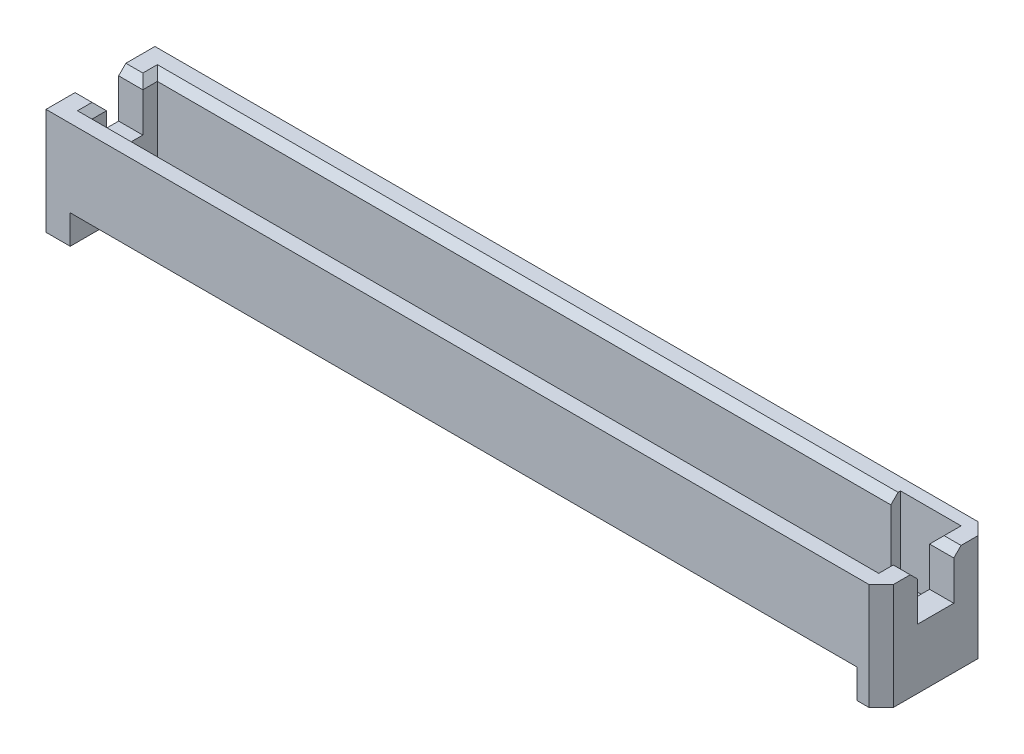
ISO-10303-21;
HEADER;
FILE_DESCRIPTION(('STEP AP214'),'2;1');
FILE_NAME('part.step','',(''),(''),'','','');
FILE_SCHEMA(('AUTOMOTIVE_DESIGN { 1 0 10303 214 1 1 1 1 }'));
ENDSEC;
DATA;
#1=APPLICATION_CONTEXT('core data for automotive mechanical design processes');
#2=APPLICATION_PROTOCOL_DEFINITION('international standard','automotive_design',2000,#1);
#3=PRODUCT_CONTEXT('',#1,'mechanical');
#4=PRODUCT('Part','Part','',(#3));
#5=PRODUCT_RELATED_PRODUCT_CATEGORY('part','',(#4));
#6=PRODUCT_DEFINITION_FORMATION('','',#4);
#7=PRODUCT_DEFINITION_CONTEXT('part definition',#1,'design');
#8=PRODUCT_DEFINITION('design','',#6,#7);
#9=PRODUCT_DEFINITION_SHAPE('','',#8);
#10=(LENGTH_UNIT() NAMED_UNIT(*) SI_UNIT(.MILLI.,.METRE.));
#11=(NAMED_UNIT(*) PLANE_ANGLE_UNIT() SI_UNIT($,.RADIAN.));
#12=(NAMED_UNIT(*) SI_UNIT($,.STERADIAN.) SOLID_ANGLE_UNIT());
#13=UNCERTAINTY_MEASURE_WITH_UNIT(LENGTH_MEASURE(1.E-05),#10,'distance_accuracy_value','');
#14=(GEOMETRIC_REPRESENTATION_CONTEXT(3) GLOBAL_UNCERTAINTY_ASSIGNED_CONTEXT((#13)) GLOBAL_UNIT_ASSIGNED_CONTEXT((#10,
#11,#12)) REPRESENTATION_CONTEXT('',''));
#15=CARTESIAN_POINT('',(0.,0.,0.));
#16=DIRECTION('',(0.,0.,1.));
#17=DIRECTION('',(1.,0.,0.));
#18=AXIS2_PLACEMENT_3D('',#15,#16,#17);
#19=CARTESIAN_POINT('',(21.2725,5.588,2.8575));
#20=DIRECTION('',(-0.707106781186547,0.,-0.707106781186548));
#21=DIRECTION('',(-0.707106781186548,0.,0.707106781186547));
#22=AXIS2_PLACEMENT_3D('',#19,#20,#21);
#23=PLANE('',#22);
#24=DIRECTION('',(0.707106781186548,0.,-0.707106781186547));
#25=VECTOR('',#24,1.);
#26=CARTESIAN_POINT('',(21.2725,0.,2.8575));
#27=LINE('',#26,#25);
#28=CARTESIAN_POINT('',(21.2725,0.,2.8575));
#29=VERTEX_POINT('',#28);
#30=CARTESIAN_POINT('',(21.9075,0.,2.2225));
#31=VERTEX_POINT('',#30);
#32=EDGE_CURVE('E10',#29,#31,#27,.T.);
#33=ORIENTED_EDGE('',*,*,#32,.T.);
#34=DIRECTION('',(0.,-1.,0.));
#35=VECTOR('',#34,1.);
#36=CARTESIAN_POINT('',(21.9075,5.588,2.2225));
#37=LINE('',#36,#35);
#38=CARTESIAN_POINT('',(21.9075,5.588,2.2225));
#39=VERTEX_POINT('',#38);
#40=EDGE_CURVE('E24',#39,#31,#37,.T.);
#41=ORIENTED_EDGE('',*,*,#40,.F.);
#42=DIRECTION('',(0.707106781186548,0.,-0.707106781186547));
#43=VECTOR('',#42,1.);
#44=CARTESIAN_POINT('',(21.2725,5.588,2.8575));
#45=LINE('',#44,#43);
#46=CARTESIAN_POINT('',(21.2725,5.588,2.8575));
#47=VERTEX_POINT('',#46);
#48=EDGE_CURVE('E752',#47,#39,#45,.T.);
#49=ORIENTED_EDGE('',*,*,#48,.F.);
#50=DIRECTION('',(0.,-1.,0.));
#51=VECTOR('',#50,1.);
#52=CARTESIAN_POINT('',(21.2725,5.588,2.8575));
#53=LINE('',#52,#51);
#54=EDGE_CURVE('E747',#47,#29,#53,.T.);
#55=ORIENTED_EDGE('',*,*,#54,.T.);
#56=EDGE_LOOP('',(#33,#41,#49,#55));
#57=FACE_BOUND('',#56,.T.);
#58=ADVANCED_FACE('F15',(#57),#23,.F.);
#59=CARTESIAN_POINT('',(-21.9075,5.588,2.8575));
#60=DIRECTION('',(0.,0.,-1.));
#61=DIRECTION('',(-1.,0.,0.));
#62=AXIS2_PLACEMENT_3D('',#59,#60,#61);
#63=PLANE('',#62);
#64=DIRECTION('',(-1.,0.,0.));
#65=VECTOR('',#64,1.);
#66=CARTESIAN_POINT('',(20.6375,1.524,2.8575));
#67=LINE('',#66,#65);
#68=CARTESIAN_POINT('',(20.6375,1.524,2.8575));
#69=VERTEX_POINT('',#68);
#70=CARTESIAN_POINT('',(-20.6375,1.524,2.8575));
#71=VERTEX_POINT('',#70);
#72=EDGE_CURVE('E741',#69,#71,#67,.T.);
#73=ORIENTED_EDGE('',*,*,#72,.F.);
#74=DIRECTION('',(0.,-1.,0.));
#75=VECTOR('',#74,1.);
#76=CARTESIAN_POINT('',(20.6375,1.524,2.8575));
#77=LINE('',#76,#75);
#78=CARTESIAN_POINT('',(20.6375,0.,2.8575));
#79=VERTEX_POINT('',#78);
#80=EDGE_CURVE('E736',#69,#79,#77,.T.);
#81=ORIENTED_EDGE('',*,*,#80,.T.);
#82=DIRECTION('',(1.,0.,0.));
#83=VECTOR('',#82,1.);
#84=CARTESIAN_POINT('',(-21.9075,0.,2.8575));
#85=LINE('',#84,#83);
#86=EDGE_CURVE('E730',#79,#29,#85,.T.);
#87=ORIENTED_EDGE('',*,*,#86,.T.);
#88=ORIENTED_EDGE('',*,*,#54,.F.);
#89=DIRECTION('',(1.,0.,0.));
#90=VECTOR('',#89,1.);
#91=CARTESIAN_POINT('',(-21.9075,5.588,2.8575));
#92=LINE('',#91,#90);
#93=CARTESIAN_POINT('',(-21.9075,5.588,2.8575));
#94=VERTEX_POINT('',#93);
#95=EDGE_CURVE('E724',#94,#47,#92,.T.);
#96=ORIENTED_EDGE('',*,*,#95,.F.);
#97=DIRECTION('',(0.,-1.,0.));
#98=VECTOR('',#97,1.);
#99=CARTESIAN_POINT('',(-21.9075,5.588,2.8575));
#100=LINE('',#99,#98);
#101=CARTESIAN_POINT('',(-21.9075,0.,2.8575));
#102=VERTEX_POINT('',#101);
#103=EDGE_CURVE('E719',#94,#102,#100,.T.);
#104=ORIENTED_EDGE('',*,*,#103,.T.);
#105=DIRECTION('',(1.,0.,0.));
#106=VECTOR('',#105,1.);
#107=CARTESIAN_POINT('',(-21.9075,0.,2.8575));
#108=LINE('',#107,#106);
#109=CARTESIAN_POINT('',(-20.6375,0.,2.8575));
#110=VERTEX_POINT('',#109);
#111=EDGE_CURVE('E714',#102,#110,#108,.T.);
#112=ORIENTED_EDGE('',*,*,#111,.T.);
#113=DIRECTION('',(0.,-1.,0.));
#114=VECTOR('',#113,1.);
#115=CARTESIAN_POINT('',(-20.6375,1.524,2.8575));
#116=LINE('',#115,#114);
#117=EDGE_CURVE('E708',#71,#110,#116,.T.);
#118=ORIENTED_EDGE('',*,*,#117,.F.);
#119=EDGE_LOOP('',(#73,#81,#87,#88,#96,#104,#112,#118));
#120=FACE_BOUND('',#119,.T.);
#121=ADVANCED_FACE('F771',(#120),#63,.F.);
#122=CARTESIAN_POINT('',(-20.6375,0.,0.));
#123=DIRECTION('',(1.,0.,0.));
#124=DIRECTION('',(0.,0.,-1.));
#125=AXIS2_PLACEMENT_3D('',#122,#123,#124);
#126=PLANE('',#125);
#127=DIRECTION('',(0.,0.496138938356834,0.868243142124459));
#128=VECTOR('',#127,1.);
#129=CARTESIAN_POINT('',(-20.6375,0.508,1.0795));
#130=LINE('',#129,#128);
#131=CARTESIAN_POINT('',(-20.6375,0.508,1.0795));
#132=VERTEX_POINT('',#131);
#133=EDGE_CURVE('E702',#132,#71,#130,.T.);
#134=ORIENTED_EDGE('',*,*,#133,.T.);
#135=ORIENTED_EDGE('',*,*,#117,.T.);
#136=DIRECTION('',(0.,0.,-1.));
#137=VECTOR('',#136,1.);
#138=CARTESIAN_POINT('',(-20.6375,0.,2.8575));
#139=LINE('',#138,#137);
#140=CARTESIAN_POINT('',(-20.6375,0.,-2.8575));
#141=VERTEX_POINT('',#140);
#142=EDGE_CURVE('E697',#110,#141,#139,.T.);
#143=ORIENTED_EDGE('',*,*,#142,.T.);
#144=DIRECTION('',(0.,1.,0.));
#145=VECTOR('',#144,1.);
#146=CARTESIAN_POINT('',(-20.6375,0.,-2.8575));
#147=LINE('',#146,#145);
#148=CARTESIAN_POINT('',(-20.6375,1.524,-2.8575));
#149=VERTEX_POINT('',#148);
#150=EDGE_CURVE('E692',#141,#149,#147,.T.);
#151=ORIENTED_EDGE('',*,*,#150,.T.);
#152=DIRECTION('',(0.,-0.496138938356834,0.868243142124459));
#153=VECTOR('',#152,1.);
#154=CARTESIAN_POINT('',(-20.6375,1.524,-2.8575));
#155=LINE('',#154,#153);
#156=CARTESIAN_POINT('',(-20.6375,0.508,-1.0795));
#157=VERTEX_POINT('',#156);
#158=EDGE_CURVE('E687',#149,#157,#155,.T.);
#159=ORIENTED_EDGE('',*,*,#158,.T.);
#160=DIRECTION('',(0.,0.,1.));
#161=VECTOR('',#160,1.);
#162=CARTESIAN_POINT('',(-20.6375,0.508,-1.0795));
#163=LINE('',#162,#161);
#164=EDGE_CURVE('E682',#157,#132,#163,.T.);
#165=ORIENTED_EDGE('',*,*,#164,.T.);
#166=EDGE_LOOP('',(#134,#135,#143,#151,#159,#165));
#167=FACE_BOUND('',#166,.T.);
#168=ADVANCED_FACE('F903',(#167),#126,.T.);
#169=CARTESIAN_POINT('',(20.6375,0.508,-1.0795));
#170=DIRECTION('',(0.,-1.,0.));
#171=DIRECTION('',(0.,0.,-1.));
#172=AXIS2_PLACEMENT_3D('',#169,#170,#171);
#173=PLANE('',#172);
#174=ORIENTED_EDGE('',*,*,#164,.F.);
#175=DIRECTION('',(-1.,0.,0.));
#176=VECTOR('',#175,1.);
#177=CARTESIAN_POINT('',(20.6375,0.508,-1.0795));
#178=LINE('',#177,#176);
#179=CARTESIAN_POINT('',(20.6375,0.508,-1.0795));
#180=VERTEX_POINT('',#179);
#181=EDGE_CURVE('E676',#180,#157,#178,.T.);
#182=ORIENTED_EDGE('',*,*,#181,.F.);
#183=DIRECTION('',(0.,0.,1.));
#184=VECTOR('',#183,1.);
#185=CARTESIAN_POINT('',(20.6375,0.508,-1.0795));
#186=LINE('',#185,#184);
#187=CARTESIAN_POINT('',(20.6375,0.508,1.0795));
#188=VERTEX_POINT('',#187);
#189=EDGE_CURVE('E671',#180,#188,#186,.T.);
#190=ORIENTED_EDGE('',*,*,#189,.T.);
#191=DIRECTION('',(-1.,0.,0.));
#192=VECTOR('',#191,1.);
#193=CARTESIAN_POINT('',(20.6375,0.508,1.0795));
#194=LINE('',#193,#192);
#195=EDGE_CURVE('E665',#188,#132,#194,.T.);
#196=ORIENTED_EDGE('',*,*,#195,.T.);
#197=EDGE_LOOP('',(#174,#182,#190,#196));
#198=FACE_BOUND('',#197,.T.);
#199=ADVANCED_FACE('F906',(#198),#173,.T.);
#200=CARTESIAN_POINT('',(20.6375,0.508,1.0795));
#201=DIRECTION('',(0.,-0.868243142124459,0.496138938356834));
#202=DIRECTION('',(0.,-0.496138938356834,-0.868243142124459));
#203=AXIS2_PLACEMENT_3D('',#200,#201,#202);
#204=PLANE('',#203);
#205=ORIENTED_EDGE('',*,*,#133,.F.);
#206=ORIENTED_EDGE('',*,*,#195,.F.);
#207=DIRECTION('',(0.,0.496138938356834,0.868243142124459));
#208=VECTOR('',#207,1.);
#209=CARTESIAN_POINT('',(20.6375,0.508,1.0795));
#210=LINE('',#209,#208);
#211=EDGE_CURVE('E659',#188,#69,#210,.T.);
#212=ORIENTED_EDGE('',*,*,#211,.T.);
#213=ORIENTED_EDGE('',*,*,#72,.T.);
#214=EDGE_LOOP('',(#205,#206,#212,#213));
#215=FACE_BOUND('',#214,.T.);
#216=ADVANCED_FACE('F912',(#215),#204,.T.);
#217=CARTESIAN_POINT('',(20.6375,0.,0.));
#218=DIRECTION('',(1.,0.,0.));
#219=DIRECTION('',(0.,0.,-1.));
#220=AXIS2_PLACEMENT_3D('',#217,#218,#219);
#221=PLANE('',#220);
#222=ORIENTED_EDGE('',*,*,#211,.F.);
#223=ORIENTED_EDGE('',*,*,#189,.F.);
#224=DIRECTION('',(0.,-0.496138938356834,0.868243142124459));
#225=VECTOR('',#224,1.);
#226=CARTESIAN_POINT('',(20.6375,1.524,-2.8575));
#227=LINE('',#226,#225);
#228=CARTESIAN_POINT('',(20.6375,1.524,-2.8575));
#229=VERTEX_POINT('',#228);
#230=EDGE_CURVE('E653',#229,#180,#227,.T.);
#231=ORIENTED_EDGE('',*,*,#230,.F.);
#232=DIRECTION('',(0.,1.,0.));
#233=VECTOR('',#232,1.);
#234=CARTESIAN_POINT('',(20.6375,0.,-2.8575));
#235=LINE('',#234,#233);
#236=CARTESIAN_POINT('',(20.6375,0.,-2.8575));
#237=VERTEX_POINT('',#236);
#238=EDGE_CURVE('E647',#237,#229,#235,.T.);
#239=ORIENTED_EDGE('',*,*,#238,.F.);
#240=DIRECTION('',(0.,0.,-1.));
#241=VECTOR('',#240,1.);
#242=CARTESIAN_POINT('',(20.6375,0.,2.8575));
#243=LINE('',#242,#241);
#244=EDGE_CURVE('E641',#79,#237,#243,.T.);
#245=ORIENTED_EDGE('',*,*,#244,.F.);
#246=ORIENTED_EDGE('',*,*,#80,.F.);
#247=EDGE_LOOP('',(#222,#223,#231,#239,#245,#246));
#248=FACE_BOUND('',#247,.T.);
#249=ADVANCED_FACE('F916',(#248),#221,.F.);
#250=CARTESIAN_POINT('',(0.,0.,0.));
#251=DIRECTION('',(0.,1.,0.));
#252=DIRECTION('',(0.,0.,1.));
#253=AXIS2_PLACEMENT_3D('',#250,#251,#252);
#254=PLANE('',#253);
#255=ORIENTED_EDGE('',*,*,#86,.F.);
#256=ORIENTED_EDGE('',*,*,#244,.T.);
#257=DIRECTION('',(-1.,0.,0.));
#258=VECTOR('',#257,1.);
#259=CARTESIAN_POINT('',(21.2725,0.,-2.8575));
#260=LINE('',#259,#258);
#261=CARTESIAN_POINT('',(21.2725,0.,-2.8575));
#262=VERTEX_POINT('',#261);
#263=EDGE_CURVE('E635',#262,#237,#260,.T.);
#264=ORIENTED_EDGE('',*,*,#263,.F.);
#265=DIRECTION('',(-0.707106781186548,0.,-0.707106781186547));
#266=VECTOR('',#265,1.);
#267=CARTESIAN_POINT('',(21.9075,0.,-2.2225));
#268=LINE('',#267,#266);
#269=CARTESIAN_POINT('',(21.9075,0.,-2.2225));
#270=VERTEX_POINT('',#269);
#271=EDGE_CURVE('E629',#270,#262,#268,.T.);
#272=ORIENTED_EDGE('',*,*,#271,.F.);
#273=DIRECTION('',(0.,0.,-1.));
#274=VECTOR('',#273,1.);
#275=CARTESIAN_POINT('',(21.9075,0.,2.2225));
#276=LINE('',#275,#274);
#277=EDGE_CURVE('E623',#31,#270,#276,.T.);
#278=ORIENTED_EDGE('',*,*,#277,.F.);
#279=ORIENTED_EDGE('',*,*,#32,.F.);
#280=EDGE_LOOP('',(#255,#256,#264,#272,#278,#279));
#281=FACE_BOUND('',#280,.T.);
#282=ADVANCED_FACE('F776',(#281),#254,.F.);
#283=CARTESIAN_POINT('',(21.9075,5.588,2.2225));
#284=DIRECTION('',(-1.,0.,0.));
#285=DIRECTION('',(0.,0.,1.));
#286=AXIS2_PLACEMENT_3D('',#283,#284,#285);
#287=PLANE('',#286);
#288=DIRECTION('',(0.,-0.707106781186548,-0.707106781186547));
#289=VECTOR('',#288,1.);
#290=CARTESIAN_POINT('',(21.9075,5.588,1.3335));
#291=LINE('',#290,#289);
#292=CARTESIAN_POINT('',(21.9075,5.588,1.3335));
#293=VERTEX_POINT('',#292);
#294=CARTESIAN_POINT('',(21.9075,5.207,0.9525));
#295=VERTEX_POINT('',#294);
#296=EDGE_CURVE('E617',#293,#295,#291,.T.);
#297=ORIENTED_EDGE('',*,*,#296,.F.);
#298=DIRECTION('',(0.,0.,-1.));
#299=VECTOR('',#298,1.);
#300=CARTESIAN_POINT('',(21.9075,5.588,2.2225));
#301=LINE('',#300,#299);
#302=EDGE_CURVE('E611',#39,#293,#301,.T.);
#303=ORIENTED_EDGE('',*,*,#302,.F.);
#304=ORIENTED_EDGE('',*,*,#40,.T.);
#305=ORIENTED_EDGE('',*,*,#277,.T.);
#306=DIRECTION('',(0.,-1.,0.));
#307=VECTOR('',#306,1.);
#308=CARTESIAN_POINT('',(21.9075,5.588,-2.2225));
#309=LINE('',#308,#307);
#310=CARTESIAN_POINT('',(21.9075,5.588,-2.2225));
#311=VERTEX_POINT('',#310);
#312=EDGE_CURVE('E605',#311,#270,#309,.T.);
#313=ORIENTED_EDGE('',*,*,#312,.F.);
#314=DIRECTION('',(0.,0.,-1.));
#315=VECTOR('',#314,1.);
#316=CARTESIAN_POINT('',(21.9075,5.588,2.2225));
#317=LINE('',#316,#315);
#318=CARTESIAN_POINT('',(21.9075,5.588,-1.3335));
#319=VERTEX_POINT('',#318);
#320=EDGE_CURVE('E599',#319,#311,#317,.T.);
#321=ORIENTED_EDGE('',*,*,#320,.F.);
#322=DIRECTION('',(0.,0.707106781186548,-0.707106781186547));
#323=VECTOR('',#322,1.);
#324=CARTESIAN_POINT('',(21.9075,5.207,-0.9525));
#325=LINE('',#324,#323);
#326=CARTESIAN_POINT('',(21.9075,5.207,-0.9525));
#327=VERTEX_POINT('',#326);
#328=EDGE_CURVE('E593',#327,#319,#325,.T.);
#329=ORIENTED_EDGE('',*,*,#328,.F.);
#330=DIRECTION('',(0.,-1.,0.));
#331=VECTOR('',#330,1.);
#332=CARTESIAN_POINT('',(21.9075,8.0264,-0.9525));
#333=LINE('',#332,#331);
#334=CARTESIAN_POINT('',(21.9075,3.1496,-0.9525));
#335=VERTEX_POINT('',#334);
#336=EDGE_CURVE('E588',#327,#335,#333,.T.);
#337=ORIENTED_EDGE('',*,*,#336,.T.);
#338=DIRECTION('',(0.,0.,-1.));
#339=VECTOR('',#338,1.);
#340=CARTESIAN_POINT('',(21.9075,3.1496,0.9525));
#341=LINE('',#340,#339);
#342=CARTESIAN_POINT('',(21.9075,3.1496,0.9525));
#343=VERTEX_POINT('',#342);
#344=EDGE_CURVE('E582',#343,#335,#341,.T.);
#345=ORIENTED_EDGE('',*,*,#344,.F.);
#346=DIRECTION('',(0.,-1.,0.));
#347=VECTOR('',#346,1.);
#348=CARTESIAN_POINT('',(21.9075,8.0264,0.9525));
#349=LINE('',#348,#347);
#350=EDGE_CURVE('E576',#295,#343,#349,.T.);
#351=ORIENTED_EDGE('',*,*,#350,.F.);
#352=EDGE_LOOP('',(#297,#303,#304,#305,#313,#321,#329,#337,#345,#351));
#353=FACE_BOUND('',#352,.T.);
#354=ADVANCED_FACE('F765',(#353),#287,.F.);
#355=CARTESIAN_POINT('',(-21.9075,8.0264,0.9525));
#356=DIRECTION('',(0.,0.,-1.));
#357=DIRECTION('',(-1.,0.,0.));
#358=AXIS2_PLACEMENT_3D('',#355,#356,#357);
#359=PLANE('',#358);
#360=DIRECTION('',(0.,-1.,0.));
#361=VECTOR('',#360,1.);
#362=CARTESIAN_POINT('',(20.6375,8.0264,0.9525));
#363=LINE('',#362,#361);
#364=CARTESIAN_POINT('',(20.6375,5.207,0.9525));
#365=VERTEX_POINT('',#364);
#366=CARTESIAN_POINT('',(20.6375,3.1496,0.9525));
#367=VERTEX_POINT('',#366);
#368=EDGE_CURVE('E570',#365,#367,#363,.T.);
#369=ORIENTED_EDGE('',*,*,#368,.F.);
#370=DIRECTION('',(-1.,0.,0.));
#371=VECTOR('',#370,1.);
#372=CARTESIAN_POINT('',(21.9075,5.207,0.9525));
#373=LINE('',#372,#371);
#374=EDGE_CURVE('E564',#295,#365,#373,.T.);
#375=ORIENTED_EDGE('',*,*,#374,.F.);
#376=ORIENTED_EDGE('',*,*,#350,.T.);
#377=DIRECTION('',(1.,0.,0.));
#378=VECTOR('',#377,1.);
#379=CARTESIAN_POINT('',(-21.9075,3.1496,0.9525));
#380=LINE('',#379,#378);
#381=EDGE_CURVE('E558',#367,#343,#380,.T.);
#382=ORIENTED_EDGE('',*,*,#381,.F.);
#383=EDGE_LOOP('',(#369,#375,#376,#382));
#384=FACE_BOUND('',#383,.T.);
#385=ADVANCED_FACE('F889',(#384),#359,.T.);
#386=CARTESIAN_POINT('',(0.,3.1496,0.));
#387=DIRECTION('',(0.,1.,0.));
#388=DIRECTION('',(0.,0.,1.));
#389=AXIS2_PLACEMENT_3D('',#386,#387,#388);
#390=PLANE('',#389);
#391=DIRECTION('',(0.,0.,-1.));
#392=VECTOR('',#391,1.);
#393=CARTESIAN_POINT('',(20.6375,3.1496,0.));
#394=LINE('',#393,#392);
#395=CARTESIAN_POINT('',(20.6375,3.1496,-0.9525));
#396=VERTEX_POINT('',#395);
#397=EDGE_CURVE('E552',#367,#396,#394,.T.);
#398=ORIENTED_EDGE('',*,*,#397,.F.);
#399=ORIENTED_EDGE('',*,*,#381,.T.);
#400=ORIENTED_EDGE('',*,*,#344,.T.);
#401=DIRECTION('',(-1.,0.,0.));
#402=VECTOR('',#401,1.);
#403=CARTESIAN_POINT('',(21.9075,3.1496,-0.9525));
#404=LINE('',#403,#402);
#405=EDGE_CURVE('E547',#335,#396,#404,.T.);
#406=ORIENTED_EDGE('',*,*,#405,.T.);
#407=EDGE_LOOP('',(#398,#399,#400,#406));
#408=FACE_BOUND('',#407,.T.);
#409=ADVANCED_FACE('F891',(#408),#390,.T.);
#410=CARTESIAN_POINT('',(21.9075,8.0264,-0.9525));
#411=DIRECTION('',(0.,0.,1.));
#412=DIRECTION('',(1.,0.,0.));
#413=AXIS2_PLACEMENT_3D('',#410,#411,#412);
#414=PLANE('',#413);
#415=ORIENTED_EDGE('',*,*,#336,.F.);
#416=DIRECTION('',(-1.,0.,0.));
#417=VECTOR('',#416,1.);
#418=CARTESIAN_POINT('',(21.9075,5.207,-0.9525));
#419=LINE('',#418,#417);
#420=CARTESIAN_POINT('',(20.6375,5.207,-0.9525));
#421=VERTEX_POINT('',#420);
#422=EDGE_CURVE('E542',#327,#421,#419,.T.);
#423=ORIENTED_EDGE('',*,*,#422,.T.);
#424=DIRECTION('',(0.,1.,0.));
#425=VECTOR('',#424,1.);
#426=CARTESIAN_POINT('',(20.6375,8.0264,-0.9525));
#427=LINE('',#426,#425);
#428=EDGE_CURVE('E536',#396,#421,#427,.T.);
#429=ORIENTED_EDGE('',*,*,#428,.F.);
#430=ORIENTED_EDGE('',*,*,#405,.F.);
#431=EDGE_LOOP('',(#415,#423,#429,#430));
#432=FACE_BOUND('',#431,.T.);
#433=ADVANCED_FACE('F792',(#432),#414,.T.);
#434=CARTESIAN_POINT('',(20.6375,1.4351,1.7145));
#435=DIRECTION('',(1.,0.,0.));
#436=DIRECTION('',(0.,0.,-1.));
#437=AXIS2_PLACEMENT_3D('',#434,#435,#436);
#438=PLANE('',#437);
#439=ORIENTED_EDGE('',*,*,#397,.T.);
#440=ORIENTED_EDGE('',*,*,#428,.T.);
#441=DIRECTION('',(0.,0.,-1.));
#442=VECTOR('',#441,1.);
#443=CARTESIAN_POINT('',(20.6375,5.207,1.7145));
#444=LINE('',#443,#442);
#445=CARTESIAN_POINT('',(20.6375,5.207,-2.2225));
#446=VERTEX_POINT('',#445);
#447=EDGE_CURVE('E531',#421,#446,#444,.T.);
#448=ORIENTED_EDGE('',*,*,#447,.T.);
#449=DIRECTION('',(0.,1.,0.));
#450=VECTOR('',#449,1.);
#451=CARTESIAN_POINT('',(20.6375,1.4351,-2.2225));
#452=LINE('',#451,#450);
#453=CARTESIAN_POINT('',(20.6375,1.4351,-2.2225));
#454=VERTEX_POINT('',#453);
#455=EDGE_CURVE('E526',#454,#446,#452,.T.);
#456=ORIENTED_EDGE('',*,*,#455,.F.);
#457=DIRECTION('',(0.,0.,-1.));
#458=VECTOR('',#457,1.);
#459=CARTESIAN_POINT('',(20.6375,1.4351,1.7145));
#460=LINE('',#459,#458);
#461=CARTESIAN_POINT('',(20.6375,1.4351,1.7145));
#462=VERTEX_POINT('',#461);
#463=EDGE_CURVE('E232',#462,#454,#460,.T.);
#464=ORIENTED_EDGE('',*,*,#463,.F.);
#465=DIRECTION('',(0.,1.,0.));
#466=VECTOR('',#465,1.);
#467=CARTESIAN_POINT('',(20.6375,1.4351,1.7145));
#468=LINE('',#467,#466);
#469=CARTESIAN_POINT('',(20.6375,5.207,1.7145));
#470=VERTEX_POINT('',#469);
#471=EDGE_CURVE('E517',#462,#470,#468,.T.);
#472=ORIENTED_EDGE('',*,*,#471,.T.);
#473=DIRECTION('',(0.,0.,-1.));
#474=VECTOR('',#473,1.);
#475=CARTESIAN_POINT('',(20.6375,5.207,1.7145));
#476=LINE('',#475,#474);
#477=EDGE_CURVE('E511',#470,#365,#476,.T.);
#478=ORIENTED_EDGE('',*,*,#477,.T.);
#479=ORIENTED_EDGE('',*,*,#368,.T.);
#480=EDGE_LOOP('',(#439,#440,#448,#456,#464,#472,#478,#479));
#481=FACE_BOUND('',#480,.T.);
#482=ADVANCED_FACE('F796',(#481),#438,.F.);
#483=CARTESIAN_POINT('',(20.6375,5.207,1.7145));
#484=DIRECTION('',(-0.707106781186548,0.707106781186548,0.));
#485=DIRECTION('',(-0.707106781186548,-0.707106781186548,0.));
#486=AXIS2_PLACEMENT_3D('',#483,#484,#485);
#487=PLANE('',#486);
#488=DIRECTION('',(0.,0.,-1.));
#489=VECTOR('',#488,1.);
#490=CARTESIAN_POINT('',(21.0185,5.588,1.7145));
#491=LINE('',#490,#489);
#492=CARTESIAN_POINT('',(21.0185,5.588,2.0955));
#493=VERTEX_POINT('',#492);
#494=CARTESIAN_POINT('',(21.0185,5.588,1.3335));
#495=VERTEX_POINT('',#494);
#496=EDGE_CURVE('E506',#493,#495,#491,.T.);
#497=ORIENTED_EDGE('',*,*,#496,.T.);
#498=DIRECTION('',(-0.577350269189626,-0.577350269189626,-0.577350269189625));
#499=VECTOR('',#498,1.);
#500=CARTESIAN_POINT('',(20.8915,5.461,1.2065));
#501=LINE('',#500,#499);
#502=EDGE_CURVE('E500',#495,#365,#501,.T.);
#503=ORIENTED_EDGE('',*,*,#502,.T.);
#504=ORIENTED_EDGE('',*,*,#477,.F.);
#505=DIRECTION('',(-0.577350269189626,-0.577350269189626,-0.577350269189626));
#506=VECTOR('',#505,1.);
#507=CARTESIAN_POINT('',(20.6375,5.207,1.7145));
#508=LINE('',#507,#506);
#509=EDGE_CURVE('E494',#493,#470,#508,.T.);
#510=ORIENTED_EDGE('',*,*,#509,.F.);
#511=EDGE_LOOP('',(#497,#503,#504,#510));
#512=FACE_BOUND('',#511,.T.);
#513=ADVANCED_FACE('F886',(#512),#487,.T.);
#514=CARTESIAN_POINT('',(-20.6375,5.207,1.7145));
#515=DIRECTION('',(0.,0.707106781186548,-0.707106781186548));
#516=DIRECTION('',(0.,0.707106781186548,0.707106781186548));
#517=AXIS2_PLACEMENT_3D('',#514,#515,#516);
#518=PLANE('',#517);
#519=DIRECTION('',(1.,0.,0.));
#520=VECTOR('',#519,1.);
#521=CARTESIAN_POINT('',(-20.6375,5.207,1.7145));
#522=LINE('',#521,#520);
#523=CARTESIAN_POINT('',(-20.6375,5.207,1.7145));
#524=VERTEX_POINT('',#523);
#525=EDGE_CURVE('E488',#524,#470,#522,.T.);
#526=ORIENTED_EDGE('',*,*,#525,.F.);
#527=DIRECTION('',(0.577350269189626,-0.577350269189626,-0.577350269189626));
#528=VECTOR('',#527,1.);
#529=CARTESIAN_POINT('',(-20.6375,5.207,1.7145));
#530=LINE('',#529,#528);
#531=CARTESIAN_POINT('',(-21.0185,5.588,2.0955));
#532=VERTEX_POINT('',#531);
#533=EDGE_CURVE('E482',#532,#524,#530,.T.);
#534=ORIENTED_EDGE('',*,*,#533,.F.);
#535=DIRECTION('',(1.,0.,0.));
#536=VECTOR('',#535,1.);
#537=CARTESIAN_POINT('',(-20.6375,5.588,2.0955));
#538=LINE('',#537,#536);
#539=EDGE_CURVE('E476',#532,#493,#538,.T.);
#540=ORIENTED_EDGE('',*,*,#539,.T.);
#541=ORIENTED_EDGE('',*,*,#509,.T.);
#542=EDGE_LOOP('',(#526,#534,#540,#541));
#543=FACE_BOUND('',#542,.T.);
#544=ADVANCED_FACE('F808',(#543),#518,.T.);
#545=CARTESIAN_POINT('',(0.,5.588,0.));
#546=DIRECTION('',(0.,1.,0.));
#547=DIRECTION('',(0.,0.,1.));
#548=AXIS2_PLACEMENT_3D('',#545,#546,#547);
#549=PLANE('',#548);
#550=ORIENTED_EDGE('',*,*,#302,.T.);
#551=DIRECTION('',(-1.,0.,0.));
#552=VECTOR('',#551,1.);
#553=CARTESIAN_POINT('',(21.9075,5.588,1.3335));
#554=LINE('',#553,#552);
#555=EDGE_CURVE('E470',#293,#495,#554,.T.);
#556=ORIENTED_EDGE('',*,*,#555,.T.);
#557=ORIENTED_EDGE('',*,*,#496,.F.);
#558=ORIENTED_EDGE('',*,*,#539,.F.);
#559=DIRECTION('',(0.,0.,1.));
#560=VECTOR('',#559,1.);
#561=CARTESIAN_POINT('',(-21.0185,5.588,-1.7145));
#562=LINE('',#561,#560);
#563=CARTESIAN_POINT('',(-21.0185,5.588,1.3335));
#564=VERTEX_POINT('',#563);
#565=EDGE_CURVE('E464',#564,#532,#562,.T.);
#566=ORIENTED_EDGE('',*,*,#565,.F.);
#567=DIRECTION('',(-1.,0.,0.));
#568=VECTOR('',#567,1.);
#569=CARTESIAN_POINT('',(21.9075,5.588,1.3335));
#570=LINE('',#569,#568);
#571=CARTESIAN_POINT('',(-21.9075,5.588,1.3335));
#572=VERTEX_POINT('',#571);
#573=EDGE_CURVE('E459',#564,#572,#570,.T.);
#574=ORIENTED_EDGE('',*,*,#573,.T.);
#575=DIRECTION('',(0.,0.,1.));
#576=VECTOR('',#575,1.);
#577=CARTESIAN_POINT('',(-21.9075,5.588,-2.8575));
#578=LINE('',#577,#576);
#579=EDGE_CURVE('E453',#572,#94,#578,.T.);
#580=ORIENTED_EDGE('',*,*,#579,.T.);
#581=ORIENTED_EDGE('',*,*,#95,.T.);
#582=ORIENTED_EDGE('',*,*,#48,.T.);
#583=EDGE_LOOP('',(#550,#556,#557,#558,#566,#574,#580,#581,#582));
#584=FACE_BOUND('',#583,.T.);
#585=ADVANCED_FACE('F768',(#584),#549,.T.);
#586=CARTESIAN_POINT('',(-21.9075,5.588,-2.8575));
#587=DIRECTION('',(1.,0.,0.));
#588=DIRECTION('',(0.,0.,-1.));
#589=AXIS2_PLACEMENT_3D('',#586,#587,#588);
#590=PLANE('',#589);
#591=DIRECTION('',(0.,-0.707106781186548,-0.707106781186547));
#592=VECTOR('',#591,1.);
#593=CARTESIAN_POINT('',(-21.9075,5.588,1.3335));
#594=LINE('',#593,#592);
#595=CARTESIAN_POINT('',(-21.9075,5.207,0.9525));
#596=VERTEX_POINT('',#595);
#597=EDGE_CURVE('E448',#572,#596,#594,.T.);
#598=ORIENTED_EDGE('',*,*,#597,.T.);
#599=DIRECTION('',(0.,-1.,0.));
#600=VECTOR('',#599,1.);
#601=CARTESIAN_POINT('',(-21.9075,8.0264,0.9525));
#602=LINE('',#601,#600);
#603=CARTESIAN_POINT('',(-21.9075,3.1496,0.9525));
#604=VERTEX_POINT('',#603);
#605=EDGE_CURVE('E443',#596,#604,#602,.T.);
#606=ORIENTED_EDGE('',*,*,#605,.T.);
#607=DIRECTION('',(0.,0.,1.));
#608=VECTOR('',#607,1.);
#609=CARTESIAN_POINT('',(-21.9075,3.1496,-0.9525));
#610=LINE('',#609,#608);
#611=CARTESIAN_POINT('',(-21.9075,3.1496,-0.9525));
#612=VERTEX_POINT('',#611);
#613=EDGE_CURVE('E437',#612,#604,#610,.T.);
#614=ORIENTED_EDGE('',*,*,#613,.F.);
#615=DIRECTION('',(0.,-1.,0.));
#616=VECTOR('',#615,1.);
#617=CARTESIAN_POINT('',(-21.9075,8.0264,-0.9525));
#618=LINE('',#617,#616);
#619=CARTESIAN_POINT('',(-21.9075,5.207,-0.9525));
#620=VERTEX_POINT('',#619);
#621=EDGE_CURVE('E432',#620,#612,#618,.T.);
#622=ORIENTED_EDGE('',*,*,#621,.F.);
#623=DIRECTION('',(0.,0.707106781186548,-0.707106781186547));
#624=VECTOR('',#623,1.);
#625=CARTESIAN_POINT('',(-21.9075,5.207,-0.9525));
#626=LINE('',#625,#624);
#627=CARTESIAN_POINT('',(-21.9075,5.588,-1.3335));
#628=VERTEX_POINT('',#627);
#629=EDGE_CURVE('E427',#620,#628,#626,.T.);
#630=ORIENTED_EDGE('',*,*,#629,.T.);
#631=DIRECTION('',(0.,0.,1.));
#632=VECTOR('',#631,1.);
#633=CARTESIAN_POINT('',(-21.9075,5.588,-2.8575));
#634=LINE('',#633,#632);
#635=CARTESIAN_POINT('',(-21.9075,5.588,-2.8575));
#636=VERTEX_POINT('',#635);
#637=EDGE_CURVE('E421',#636,#628,#634,.T.);
#638=ORIENTED_EDGE('',*,*,#637,.F.);
#639=DIRECTION('',(0.,-1.,0.));
#640=VECTOR('',#639,1.);
#641=CARTESIAN_POINT('',(-21.9075,5.588,-2.8575));
#642=LINE('',#641,#640);
#643=CARTESIAN_POINT('',(-21.9075,0.,-2.8575));
#644=VERTEX_POINT('',#643);
#645=EDGE_CURVE('E416',#636,#644,#642,.T.);
#646=ORIENTED_EDGE('',*,*,#645,.T.);
#647=DIRECTION('',(0.,0.,1.));
#648=VECTOR('',#647,1.);
#649=CARTESIAN_POINT('',(-21.9075,0.,-2.8575));
#650=LINE('',#649,#648);
#651=EDGE_CURVE('E410',#644,#102,#650,.T.);
#652=ORIENTED_EDGE('',*,*,#651,.T.);
#653=ORIENTED_EDGE('',*,*,#103,.F.);
#654=ORIENTED_EDGE('',*,*,#579,.F.);
#655=EDGE_LOOP('',(#598,#606,#614,#622,#630,#638,#646,#652,#653,#654));
#656=FACE_BOUND('',#655,.T.);
#657=ADVANCED_FACE('F880',(#656),#590,.F.);
#658=CARTESIAN_POINT('',(0.,0.,0.));
#659=DIRECTION('',(0.,1.,0.));
#660=DIRECTION('',(0.,0.,1.));
#661=AXIS2_PLACEMENT_3D('',#658,#659,#660);
#662=PLANE('',#661);
#663=ORIENTED_EDGE('',*,*,#142,.F.);
#664=ORIENTED_EDGE('',*,*,#111,.F.);
#665=ORIENTED_EDGE('',*,*,#651,.F.);
#666=DIRECTION('',(-1.,0.,0.));
#667=VECTOR('',#666,1.);
#668=CARTESIAN_POINT('',(21.2725,0.,-2.8575));
#669=LINE('',#668,#667);
#670=EDGE_CURVE('E404',#141,#644,#669,.T.);
#671=ORIENTED_EDGE('',*,*,#670,.F.);
#672=EDGE_LOOP('',(#663,#664,#665,#671));
#673=FACE_BOUND('',#672,.T.);
#674=ADVANCED_FACE('F980',(#673),#662,.F.);
#675=CARTESIAN_POINT('',(21.2725,5.588,-2.8575));
#676=DIRECTION('',(0.,0.,1.));
#677=DIRECTION('',(1.,0.,0.));
#678=AXIS2_PLACEMENT_3D('',#675,#676,#677);
#679=PLANE('',#678);
#680=ORIENTED_EDGE('',*,*,#263,.T.);
#681=ORIENTED_EDGE('',*,*,#238,.T.);
#682=DIRECTION('',(-1.,0.,0.));
#683=VECTOR('',#682,1.);
#684=CARTESIAN_POINT('',(20.6375,1.524,-2.8575));
#685=LINE('',#684,#683);
#686=EDGE_CURVE('E398',#229,#149,#685,.T.);
#687=ORIENTED_EDGE('',*,*,#686,.T.);
#688=ORIENTED_EDGE('',*,*,#150,.F.);
#689=ORIENTED_EDGE('',*,*,#670,.T.);
#690=ORIENTED_EDGE('',*,*,#645,.F.);
#691=DIRECTION('',(-1.,0.,0.));
#692=VECTOR('',#691,1.);
#693=CARTESIAN_POINT('',(21.2725,5.588,-2.8575));
#694=LINE('',#693,#692);
#695=CARTESIAN_POINT('',(21.2725,5.588,-2.8575));
#696=VERTEX_POINT('',#695);
#697=EDGE_CURVE('E392',#696,#636,#694,.T.);
#698=ORIENTED_EDGE('',*,*,#697,.F.);
#699=DIRECTION('',(0.,-1.,0.));
#700=VECTOR('',#699,1.);
#701=CARTESIAN_POINT('',(21.2725,5.588,-2.8575));
#702=LINE('',#701,#700);
#703=EDGE_CURVE('E386',#696,#262,#702,.T.);
#704=ORIENTED_EDGE('',*,*,#703,.T.);
#705=EDGE_LOOP('',(#680,#681,#687,#688,#689,#690,#698,#704));
#706=FACE_BOUND('',#705,.T.);
#707=ADVANCED_FACE('F988',(#706),#679,.F.);
#708=CARTESIAN_POINT('',(21.9075,5.588,-2.2225));
#709=DIRECTION('',(-0.707106781186547,0.,0.707106781186548));
#710=DIRECTION('',(0.707106781186548,0.,0.707106781186547));
#711=AXIS2_PLACEMENT_3D('',#708,#709,#710);
#712=PLANE('',#711);
#713=ORIENTED_EDGE('',*,*,#271,.T.);
#714=ORIENTED_EDGE('',*,*,#703,.F.);
#715=DIRECTION('',(-0.707106781186548,0.,-0.707106781186547));
#716=VECTOR('',#715,1.);
#717=CARTESIAN_POINT('',(21.9075,5.588,-2.2225));
#718=LINE('',#717,#716);
#719=EDGE_CURVE('E380',#311,#696,#718,.T.);
#720=ORIENTED_EDGE('',*,*,#719,.F.);
#721=ORIENTED_EDGE('',*,*,#312,.T.);
#722=EDGE_LOOP('',(#713,#714,#720,#721));
#723=FACE_BOUND('',#722,.T.);
#724=ADVANCED_FACE('F779',(#723),#712,.F.);
#725=CARTESIAN_POINT('',(0.,5.588,0.));
#726=DIRECTION('',(0.,1.,0.));
#727=DIRECTION('',(0.,0.,1.));
#728=AXIS2_PLACEMENT_3D('',#725,#726,#727);
#729=PLANE('',#728);
#730=DIRECTION('',(0.,0.,1.));
#731=VECTOR('',#730,1.);
#732=CARTESIAN_POINT('',(17.8435,5.588,-2.2225));
#733=LINE('',#732,#731);
#734=CARTESIAN_POINT('',(17.8435,5.588,-2.2225));
#735=VERTEX_POINT('',#734);
#736=CARTESIAN_POINT('',(17.8435,5.588,-2.0955));
#737=VERTEX_POINT('',#736);
#738=EDGE_CURVE('E375',#735,#737,#733,.T.);
#739=ORIENTED_EDGE('',*,*,#738,.F.);
#740=DIRECTION('',(-1.,0.,0.));
#741=VECTOR('',#740,1.);
#742=CARTESIAN_POINT('',(21.0185,5.588,-2.2225));
#743=LINE('',#742,#741);
#744=CARTESIAN_POINT('',(21.0185,5.588,-2.2225));
#745=VERTEX_POINT('',#744);
#746=EDGE_CURVE('E253',#745,#735,#743,.T.);
#747=ORIENTED_EDGE('',*,*,#746,.F.);
#748=DIRECTION('',(0.,0.,-1.));
#749=VECTOR('',#748,1.);
#750=CARTESIAN_POINT('',(21.0185,5.588,1.7145));
#751=LINE('',#750,#749);
#752=CARTESIAN_POINT('',(21.0185,5.588,-1.3335));
#753=VERTEX_POINT('',#752);
#754=EDGE_CURVE('E365',#753,#745,#751,.T.);
#755=ORIENTED_EDGE('',*,*,#754,.F.);
#756=DIRECTION('',(-1.,0.,0.));
#757=VECTOR('',#756,1.);
#758=CARTESIAN_POINT('',(21.9075,5.588,-1.3335));
#759=LINE('',#758,#757);
#760=EDGE_CURVE('E359',#319,#753,#759,.T.);
#761=ORIENTED_EDGE('',*,*,#760,.F.);
#762=ORIENTED_EDGE('',*,*,#320,.T.);
#763=ORIENTED_EDGE('',*,*,#719,.T.);
#764=ORIENTED_EDGE('',*,*,#697,.T.);
#765=ORIENTED_EDGE('',*,*,#637,.T.);
#766=DIRECTION('',(-1.,0.,0.));
#767=VECTOR('',#766,1.);
#768=CARTESIAN_POINT('',(21.9075,5.588,-1.3335));
#769=LINE('',#768,#767);
#770=CARTESIAN_POINT('',(-21.0185,5.588,-1.3335));
#771=VERTEX_POINT('',#770);
#772=EDGE_CURVE('E353',#771,#628,#769,.T.);
#773=ORIENTED_EDGE('',*,*,#772,.F.);
#774=DIRECTION('',(0.,0.,1.));
#775=VECTOR('',#774,1.);
#776=CARTESIAN_POINT('',(-21.0185,5.588,-1.7145));
#777=LINE('',#776,#775);
#778=CARTESIAN_POINT('',(-21.0185,5.588,-2.0955));
#779=VERTEX_POINT('',#778);
#780=EDGE_CURVE('E347',#779,#771,#777,.T.);
#781=ORIENTED_EDGE('',*,*,#780,.F.);
#782=DIRECTION('',(-1.,0.,0.));
#783=VECTOR('',#782,1.);
#784=CARTESIAN_POINT('',(20.6375,5.588,-2.0955));
#785=LINE('',#784,#783);
#786=EDGE_CURVE('E341',#737,#779,#785,.T.);
#787=ORIENTED_EDGE('',*,*,#786,.F.);
#788=EDGE_LOOP('',(#739,#747,#755,#761,#762,#763,#764,#765,#773,#781,#787));
#789=FACE_BOUND('',#788,.T.);
#790=ADVANCED_FACE('F784',(#789),#729,.T.);
#791=CARTESIAN_POINT('',(20.6375,5.207,-1.7145));
#792=DIRECTION('',(0.,0.707106781186548,0.707106781186548));
#793=DIRECTION('',(0.,-0.707106781186548,0.707106781186548));
#794=AXIS2_PLACEMENT_3D('',#791,#792,#793);
#795=PLANE('',#794);
#796=DIRECTION('',(0.,-0.707106781186547,0.707106781186548));
#797=VECTOR('',#796,1.);
#798=CARTESIAN_POINT('',(17.8435,5.207,-1.7145));
#799=LINE('',#798,#797);
#800=CARTESIAN_POINT('',(17.8435,5.207,-1.7145));
#801=VERTEX_POINT('',#800);
#802=EDGE_CURVE('E336',#737,#801,#799,.T.);
#803=ORIENTED_EDGE('',*,*,#802,.F.);
#804=ORIENTED_EDGE('',*,*,#786,.T.);
#805=DIRECTION('',(0.577350269189626,-0.577350269189626,0.577350269189626));
#806=VECTOR('',#805,1.);
#807=CARTESIAN_POINT('',(-20.6375,5.207,-1.7145));
#808=LINE('',#807,#806);
#809=CARTESIAN_POINT('',(-20.6375,5.207,-1.7145));
#810=VERTEX_POINT('',#809);
#811=EDGE_CURVE('E331',#779,#810,#808,.T.);
#812=ORIENTED_EDGE('',*,*,#811,.T.);
#813=DIRECTION('',(-1.,0.,0.));
#814=VECTOR('',#813,1.);
#815=CARTESIAN_POINT('',(20.6375,5.207,-1.7145));
#816=LINE('',#815,#814);
#817=EDGE_CURVE('E325',#801,#810,#816,.T.);
#818=ORIENTED_EDGE('',*,*,#817,.F.);
#819=EDGE_LOOP('',(#803,#804,#812,#818));
#820=FACE_BOUND('',#819,.T.);
#821=ADVANCED_FACE('F1012',(#820),#795,.T.);
#822=CARTESIAN_POINT('',(20.6375,1.4351,-1.7145));
#823=DIRECTION('',(0.,0.,-1.));
#824=DIRECTION('',(-1.,0.,0.));
#825=AXIS2_PLACEMENT_3D('',#822,#823,#824);
#826=PLANE('',#825);
#827=DIRECTION('',(-1.,0.,0.));
#828=VECTOR('',#827,1.);
#829=CARTESIAN_POINT('',(20.6375,1.4351,-1.7145));
#830=LINE('',#829,#828);
#831=CARTESIAN_POINT('',(17.8435,1.4351,-1.7145));
#832=VERTEX_POINT('',#831);
#833=CARTESIAN_POINT('',(-20.6375,1.4351,-1.7145));
#834=VERTEX_POINT('',#833);
#835=EDGE_CURVE('E320',#832,#834,#830,.T.);
#836=ORIENTED_EDGE('',*,*,#835,.F.);
#837=DIRECTION('',(0.,1.,0.));
#838=VECTOR('',#837,1.);
#839=CARTESIAN_POINT('',(17.8435,1.4351,-1.7145));
#840=LINE('',#839,#838);
#841=EDGE_CURVE('E247',#832,#801,#840,.T.);
#842=ORIENTED_EDGE('',*,*,#841,.T.);
#843=ORIENTED_EDGE('',*,*,#817,.T.);
#844=DIRECTION('',(0.,1.,0.));
#845=VECTOR('',#844,1.);
#846=CARTESIAN_POINT('',(-20.6375,1.4351,-1.7145));
#847=LINE('',#846,#845);
#848=EDGE_CURVE('E310',#834,#810,#847,.T.);
#849=ORIENTED_EDGE('',*,*,#848,.F.);
#850=EDGE_LOOP('',(#836,#842,#843,#849));
#851=FACE_BOUND('',#850,.T.);
#852=ADVANCED_FACE('F1020',(#851),#826,.F.);
#853=CARTESIAN_POINT('',(-20.6375,1.4351,-1.7145));
#854=DIRECTION('',(-1.,0.,0.));
#855=DIRECTION('',(0.,0.,1.));
#856=AXIS2_PLACEMENT_3D('',#853,#854,#855);
#857=PLANE('',#856);
#858=DIRECTION('',(0.,0.,1.));
#859=VECTOR('',#858,1.);
#860=CARTESIAN_POINT('',(-20.6375,5.207,-1.7145));
#861=LINE('',#860,#859);
#862=CARTESIAN_POINT('',(-20.6375,5.207,-0.9525));
#863=VERTEX_POINT('',#862);
#864=EDGE_CURVE('E305',#810,#863,#861,.T.);
#865=ORIENTED_EDGE('',*,*,#864,.T.);
#866=DIRECTION('',(0.,-1.,0.));
#867=VECTOR('',#866,1.);
#868=CARTESIAN_POINT('',(-20.6375,8.0264,-0.9525));
#869=LINE('',#868,#867);
#870=CARTESIAN_POINT('',(-20.6375,3.1496,-0.9525));
#871=VERTEX_POINT('',#870);
#872=EDGE_CURVE('E300',#863,#871,#869,.T.);
#873=ORIENTED_EDGE('',*,*,#872,.T.);
#874=DIRECTION('',(0.,0.,1.));
#875=VECTOR('',#874,1.);
#876=CARTESIAN_POINT('',(-20.6375,3.1496,0.));
#877=LINE('',#876,#875);
#878=CARTESIAN_POINT('',(-20.6375,3.1496,0.9525));
#879=VERTEX_POINT('',#878);
#880=EDGE_CURVE('E295',#871,#879,#877,.T.);
#881=ORIENTED_EDGE('',*,*,#880,.T.);
#882=DIRECTION('',(0.,1.,0.));
#883=VECTOR('',#882,1.);
#884=CARTESIAN_POINT('',(-20.6375,8.0264,0.9525));
#885=LINE('',#884,#883);
#886=CARTESIAN_POINT('',(-20.6375,5.207,0.9525));
#887=VERTEX_POINT('',#886);
#888=EDGE_CURVE('E290',#879,#887,#885,.T.);
#889=ORIENTED_EDGE('',*,*,#888,.T.);
#890=DIRECTION('',(0.,0.,1.));
#891=VECTOR('',#890,1.);
#892=CARTESIAN_POINT('',(-20.6375,5.207,-1.7145));
#893=LINE('',#892,#891);
#894=EDGE_CURVE('E284',#887,#524,#893,.T.);
#895=ORIENTED_EDGE('',*,*,#894,.T.);
#896=DIRECTION('',(0.,1.,0.));
#897=VECTOR('',#896,1.);
#898=CARTESIAN_POINT('',(-20.6375,1.4351,1.7145));
#899=LINE('',#898,#897);
#900=CARTESIAN_POINT('',(-20.6375,1.4351,1.7145));
#901=VERTEX_POINT('',#900);
#902=EDGE_CURVE('E278',#901,#524,#899,.T.);
#903=ORIENTED_EDGE('',*,*,#902,.F.);
#904=DIRECTION('',(0.,0.,1.));
#905=VECTOR('',#904,1.);
#906=CARTESIAN_POINT('',(-20.6375,1.4351,-1.7145));
#907=LINE('',#906,#905);
#908=EDGE_CURVE('E237',#834,#901,#907,.T.);
#909=ORIENTED_EDGE('',*,*,#908,.F.);
#910=ORIENTED_EDGE('',*,*,#848,.T.);
#911=EDGE_LOOP('',(#865,#873,#881,#889,#895,#903,#909,#910));
#912=FACE_BOUND('',#911,.T.);
#913=ADVANCED_FACE('F812',(#912),#857,.F.);
#914=CARTESIAN_POINT('',(0.,1.4351,0.));
#915=DIRECTION('',(0.,1.,0.));
#916=DIRECTION('',(0.,0.,1.));
#917=AXIS2_PLACEMENT_3D('',#914,#915,#916);
#918=PLANE('',#917);
#919=ORIENTED_EDGE('',*,*,#463,.T.);
#920=DIRECTION('',(1.,0.,0.));
#921=VECTOR('',#920,1.);
#922=CARTESIAN_POINT('',(17.8435,1.4351,-2.2225));
#923=LINE('',#922,#921);
#924=CARTESIAN_POINT('',(17.8435,1.4351,-2.2225));
#925=VERTEX_POINT('',#924);
#926=EDGE_CURVE('E225',#925,#454,#923,.T.);
#927=ORIENTED_EDGE('',*,*,#926,.F.);
#928=DIRECTION('',(0.,0.,1.));
#929=VECTOR('',#928,1.);
#930=CARTESIAN_POINT('',(17.8435,1.4351,-2.2225));
#931=LINE('',#930,#929);
#932=EDGE_CURVE('E229',#925,#832,#931,.T.);
#933=ORIENTED_EDGE('',*,*,#932,.T.);
#934=ORIENTED_EDGE('',*,*,#835,.T.);
#935=ORIENTED_EDGE('',*,*,#908,.T.);
#936=DIRECTION('',(1.,0.,0.));
#937=VECTOR('',#936,1.);
#938=CARTESIAN_POINT('',(-20.6375,1.4351,1.7145));
#939=LINE('',#938,#937);
#940=EDGE_CURVE('E249',#901,#462,#939,.T.);
#941=ORIENTED_EDGE('',*,*,#940,.T.);
#942=EDGE_LOOP('',(#919,#927,#933,#934,#935,#941));
#943=FACE_BOUND('',#942,.T.);
#944=ADVANCED_FACE('F227',(#943),#918,.T.);
#945=CARTESIAN_POINT('',(-20.6375,1.4351,1.7145));
#946=DIRECTION('',(0.,0.,1.));
#947=DIRECTION('',(1.,0.,0.));
#948=AXIS2_PLACEMENT_3D('',#945,#946,#947);
#949=PLANE('',#948);
#950=ORIENTED_EDGE('',*,*,#525,.T.);
#951=ORIENTED_EDGE('',*,*,#471,.F.);
#952=ORIENTED_EDGE('',*,*,#940,.F.);
#953=ORIENTED_EDGE('',*,*,#902,.T.);
#954=EDGE_LOOP('',(#950,#951,#952,#953));
#955=FACE_BOUND('',#954,.T.);
#956=ADVANCED_FACE('F806',(#955),#949,.F.);
#957=CARTESIAN_POINT('',(17.8435,5.588,-2.2225));
#958=DIRECTION('',(-1.,0.,0.));
#959=DIRECTION('',(0.,0.,1.));
#960=AXIS2_PLACEMENT_3D('',#957,#958,#959);
#961=PLANE('',#960);
#962=ORIENTED_EDGE('',*,*,#802,.T.);
#963=ORIENTED_EDGE('',*,*,#841,.F.);
#964=ORIENTED_EDGE('',*,*,#932,.F.);
#965=DIRECTION('',(0.,-1.,0.));
#966=VECTOR('',#965,1.);
#967=CARTESIAN_POINT('',(17.8435,5.588,-2.2225));
#968=LINE('',#967,#966);
#969=EDGE_CURVE('E244',#735,#925,#968,.T.);
#970=ORIENTED_EDGE('',*,*,#969,.F.);
#971=ORIENTED_EDGE('',*,*,#738,.T.);
#972=EDGE_LOOP('',(#962,#963,#964,#970,#971));
#973=FACE_BOUND('',#972,.T.);
#974=ADVANCED_FACE('F242',(#973),#961,.F.);
#975=CARTESIAN_POINT('',(0.,0.,-2.2225));
#976=DIRECTION('',(0.,0.,1.));
#977=DIRECTION('',(1.,0.,0.));
#978=AXIS2_PLACEMENT_3D('',#975,#976,#977);
#979=PLANE('',#978);
#980=ORIENTED_EDGE('',*,*,#746,.T.);
#981=ORIENTED_EDGE('',*,*,#969,.T.);
#982=ORIENTED_EDGE('',*,*,#926,.T.);
#983=ORIENTED_EDGE('',*,*,#455,.T.);
#984=DIRECTION('',(0.707106781186547,0.707106781186548,0.));
#985=VECTOR('',#984,1.);
#986=CARTESIAN_POINT('',(20.6375,5.207,-2.2225));
#987=LINE('',#986,#985);
#988=EDGE_CURVE('E255',#446,#745,#987,.T.);
#989=ORIENTED_EDGE('',*,*,#988,.T.);
#990=EDGE_LOOP('',(#980,#981,#982,#983,#989));
#991=FACE_BOUND('',#990,.T.);
#992=ADVANCED_FACE('F251',(#991),#979,.T.);
#993=CARTESIAN_POINT('',(20.6375,5.207,1.7145));
#994=DIRECTION('',(-0.707106781186548,0.707106781186548,0.));
#995=DIRECTION('',(-0.707106781186548,-0.707106781186548,0.));
#996=AXIS2_PLACEMENT_3D('',#993,#994,#995);
#997=PLANE('',#996);
#998=ORIENTED_EDGE('',*,*,#447,.F.);
#999=DIRECTION('',(0.577350269189626,0.577350269189626,-0.577350269189625));
#1000=VECTOR('',#999,1.);
#1001=CARTESIAN_POINT('',(19.7485,4.318,-0.0635000000000018));
#1002=LINE('',#1001,#1000);
#1003=EDGE_CURVE('E262',#421,#753,#1002,.T.);
#1004=ORIENTED_EDGE('',*,*,#1003,.T.);
#1005=ORIENTED_EDGE('',*,*,#754,.T.);
#1006=ORIENTED_EDGE('',*,*,#988,.F.);
#1007=EDGE_LOOP('',(#998,#1004,#1005,#1006));
#1008=FACE_BOUND('',#1007,.T.);
#1009=ADVANCED_FACE('F800',(#1008),#997,.T.);
#1010=CARTESIAN_POINT('',(21.9075,5.207,-0.9525));
#1011=DIRECTION('',(0.,0.707106781186547,0.707106781186548));
#1012=DIRECTION('',(0.,-0.707106781186548,0.707106781186547));
#1013=AXIS2_PLACEMENT_3D('',#1010,#1011,#1012);
#1014=PLANE('',#1013);
#1015=ORIENTED_EDGE('',*,*,#422,.F.);
#1016=ORIENTED_EDGE('',*,*,#328,.T.);
#1017=ORIENTED_EDGE('',*,*,#760,.T.);
#1018=ORIENTED_EDGE('',*,*,#1003,.F.);
#1019=EDGE_LOOP('',(#1015,#1016,#1017,#1018));
#1020=FACE_BOUND('',#1019,.T.);
#1021=ADVANCED_FACE('F789',(#1020),#1014,.T.);
#1022=CARTESIAN_POINT('',(-20.6375,5.207,-1.7145));
#1023=DIRECTION('',(0.707106781186548,0.707106781186548,0.));
#1024=DIRECTION('',(-0.707106781186548,0.707106781186548,0.));
#1025=AXIS2_PLACEMENT_3D('',#1022,#1023,#1024);
#1026=PLANE('',#1025);
#1027=ORIENTED_EDGE('',*,*,#894,.F.);
#1028=DIRECTION('',(-0.577350269189626,0.577350269189626,0.577350269189625));
#1029=VECTOR('',#1028,1.);
#1030=CARTESIAN_POINT('',(-19.7485,4.318,0.0635000000000013));
#1031=LINE('',#1030,#1029);
#1032=EDGE_CURVE('E818',#887,#564,#1031,.T.);
#1033=ORIENTED_EDGE('',*,*,#1032,.T.);
#1034=ORIENTED_EDGE('',*,*,#565,.T.);
#1035=ORIENTED_EDGE('',*,*,#533,.T.);
#1036=EDGE_LOOP('',(#1027,#1033,#1034,#1035));
#1037=FACE_BOUND('',#1036,.T.);
#1038=ADVANCED_FACE('F817',(#1037),#1026,.T.);
#1039=CARTESIAN_POINT('',(21.9075,5.588,1.3335));
#1040=DIRECTION('',(0.,0.707106781186547,-0.707106781186548));
#1041=DIRECTION('',(0.,0.707106781186548,0.707106781186547));
#1042=AXIS2_PLACEMENT_3D('',#1039,#1040,#1041);
#1043=PLANE('',#1042);
#1044=DIRECTION('',(-1.,0.,0.));
#1045=VECTOR('',#1044,1.);
#1046=CARTESIAN_POINT('',(21.9075,5.207,0.9525));
#1047=LINE('',#1046,#1045);
#1048=EDGE_CURVE('E825',#887,#596,#1047,.T.);
#1049=ORIENTED_EDGE('',*,*,#1048,.T.);
#1050=ORIENTED_EDGE('',*,*,#597,.F.);
#1051=ORIENTED_EDGE('',*,*,#573,.F.);
#1052=ORIENTED_EDGE('',*,*,#1032,.F.);
#1053=EDGE_LOOP('',(#1049,#1050,#1051,#1052));
#1054=FACE_BOUND('',#1053,.T.);
#1055=ADVANCED_FACE('F823',(#1054),#1043,.T.);
#1056=CARTESIAN_POINT('',(-21.9075,8.0264,0.9525));
#1057=DIRECTION('',(0.,0.,-1.));
#1058=DIRECTION('',(-1.,0.,0.));
#1059=AXIS2_PLACEMENT_3D('',#1056,#1057,#1058);
#1060=PLANE('',#1059);
#1061=ORIENTED_EDGE('',*,*,#605,.F.);
#1062=ORIENTED_EDGE('',*,*,#1048,.F.);
#1063=ORIENTED_EDGE('',*,*,#888,.F.);
#1064=DIRECTION('',(1.,0.,0.));
#1065=VECTOR('',#1064,1.);
#1066=CARTESIAN_POINT('',(-21.9075,3.1496,0.9525));
#1067=LINE('',#1066,#1065);
#1068=EDGE_CURVE('E834',#604,#879,#1067,.T.);
#1069=ORIENTED_EDGE('',*,*,#1068,.F.);
#1070=EDGE_LOOP('',(#1061,#1062,#1063,#1069));
#1071=FACE_BOUND('',#1070,.T.);
#1072=ADVANCED_FACE('F830',(#1071),#1060,.T.);
#1073=CARTESIAN_POINT('',(0.,3.1496,0.));
#1074=DIRECTION('',(0.,1.,0.));
#1075=DIRECTION('',(0.,0.,1.));
#1076=AXIS2_PLACEMENT_3D('',#1073,#1074,#1075);
#1077=PLANE('',#1076);
#1078=ORIENTED_EDGE('',*,*,#880,.F.);
#1079=DIRECTION('',(-1.,0.,0.));
#1080=VECTOR('',#1079,1.);
#1081=CARTESIAN_POINT('',(21.9075,3.1496,-0.9525));
#1082=LINE('',#1081,#1080);
#1083=EDGE_CURVE('E837',#871,#612,#1082,.T.);
#1084=ORIENTED_EDGE('',*,*,#1083,.T.);
#1085=ORIENTED_EDGE('',*,*,#613,.T.);
#1086=ORIENTED_EDGE('',*,*,#1068,.T.);
#1087=EDGE_LOOP('',(#1078,#1084,#1085,#1086));
#1088=FACE_BOUND('',#1087,.T.);
#1089=ADVANCED_FACE('F873',(#1088),#1077,.T.);
#1090=CARTESIAN_POINT('',(21.9075,8.0264,-0.9525));
#1091=DIRECTION('',(0.,0.,1.));
#1092=DIRECTION('',(1.,0.,0.));
#1093=AXIS2_PLACEMENT_3D('',#1090,#1091,#1092);
#1094=PLANE('',#1093);
#1095=ORIENTED_EDGE('',*,*,#872,.F.);
#1096=DIRECTION('',(-1.,0.,0.));
#1097=VECTOR('',#1096,1.);
#1098=CARTESIAN_POINT('',(21.9075,5.207,-0.9525));
#1099=LINE('',#1098,#1097);
#1100=EDGE_CURVE('E853',#863,#620,#1099,.T.);
#1101=ORIENTED_EDGE('',*,*,#1100,.T.);
#1102=ORIENTED_EDGE('',*,*,#621,.T.);
#1103=ORIENTED_EDGE('',*,*,#1083,.F.);
#1104=EDGE_LOOP('',(#1095,#1101,#1102,#1103));
#1105=FACE_BOUND('',#1104,.T.);
#1106=ADVANCED_FACE('F876',(#1105),#1094,.T.);
#1107=CARTESIAN_POINT('',(21.9075,5.207,-0.9525));
#1108=DIRECTION('',(0.,0.707106781186547,0.707106781186548));
#1109=DIRECTION('',(0.,-0.707106781186548,0.707106781186547));
#1110=AXIS2_PLACEMENT_3D('',#1107,#1108,#1109);
#1111=PLANE('',#1110);
#1112=ORIENTED_EDGE('',*,*,#772,.T.);
#1113=ORIENTED_EDGE('',*,*,#629,.F.);
#1114=ORIENTED_EDGE('',*,*,#1100,.F.);
#1115=DIRECTION('',(0.577350269189626,-0.577350269189626,0.577350269189625));
#1116=VECTOR('',#1115,1.);
#1117=CARTESIAN_POINT('',(-20.8915,5.461,-1.2065));
#1118=LINE('',#1117,#1116);
#1119=EDGE_CURVE('E851',#771,#863,#1118,.T.);
#1120=ORIENTED_EDGE('',*,*,#1119,.F.);
#1121=EDGE_LOOP('',(#1112,#1113,#1114,#1120));
#1122=FACE_BOUND('',#1121,.T.);
#1123=ADVANCED_FACE('F1114',(#1122),#1111,.T.);
#1124=CARTESIAN_POINT('',(-20.6375,5.207,-1.7145));
#1125=DIRECTION('',(0.707106781186548,0.707106781186548,0.));
#1126=DIRECTION('',(-0.707106781186548,0.707106781186548,0.));
#1127=AXIS2_PLACEMENT_3D('',#1124,#1125,#1126);
#1128=PLANE('',#1127);
#1129=ORIENTED_EDGE('',*,*,#780,.T.);
#1130=ORIENTED_EDGE('',*,*,#1119,.T.);
#1131=ORIENTED_EDGE('',*,*,#864,.F.);
#1132=ORIENTED_EDGE('',*,*,#811,.F.);
#1133=EDGE_LOOP('',(#1129,#1130,#1131,#1132));
#1134=FACE_BOUND('',#1133,.T.);
#1135=ADVANCED_FACE('F1122',(#1134),#1128,.T.);
#1136=CARTESIAN_POINT('',(20.6375,1.524,-2.8575));
#1137=DIRECTION('',(0.,-0.868243142124459,-0.496138938356834));
#1138=DIRECTION('',(0.,0.496138938356834,-0.868243142124459));
#1139=AXIS2_PLACEMENT_3D('',#1136,#1137,#1138);
#1140=PLANE('',#1139);
#1141=ORIENTED_EDGE('',*,*,#158,.F.);
#1142=ORIENTED_EDGE('',*,*,#686,.F.);
#1143=ORIENTED_EDGE('',*,*,#230,.T.);
#1144=ORIENTED_EDGE('',*,*,#181,.T.);
#1145=EDGE_LOOP('',(#1141,#1142,#1143,#1144));
#1146=FACE_BOUND('',#1145,.T.);
#1147=ADVANCED_FACE('F1131',(#1146),#1140,.T.);
#1148=CARTESIAN_POINT('',(21.9075,5.588,1.3335));
#1149=DIRECTION('',(0.,0.707106781186547,-0.707106781186548));
#1150=DIRECTION('',(0.,0.707106781186548,0.707106781186547));
#1151=AXIS2_PLACEMENT_3D('',#1148,#1149,#1150);
#1152=PLANE('',#1151);
#1153=ORIENTED_EDGE('',*,*,#555,.F.);
#1154=ORIENTED_EDGE('',*,*,#296,.T.);
#1155=ORIENTED_EDGE('',*,*,#374,.T.);
#1156=ORIENTED_EDGE('',*,*,#502,.F.);
#1157=EDGE_LOOP('',(#1153,#1154,#1155,#1156));
#1158=FACE_BOUND('',#1157,.T.);
#1159=ADVANCED_FACE('F1139',(#1158),#1152,.T.);
#1160=CLOSED_SHELL('',(#58,#121,#168,#199,#216,#249,#282,#354,#385,#409,#433,#482,#513,#544,
#585,#657,#674,#707,#724,#790,#821,#852,#913,#944,#956,#974,#992,#1009,#1021,#1038,#1055,#1072,
#1089,#1106,#1123,#1135,#1147,#1159));
#1161=MANIFOLD_SOLID_BREP('B1',#1160);
#1162=ADVANCED_BREP_SHAPE_REPRESENTATION('',(#18,#1161),#14);
#1163=SHAPE_DEFINITION_REPRESENTATION(#9,#1162);
ENDSEC;
END-ISO-10303-21;
